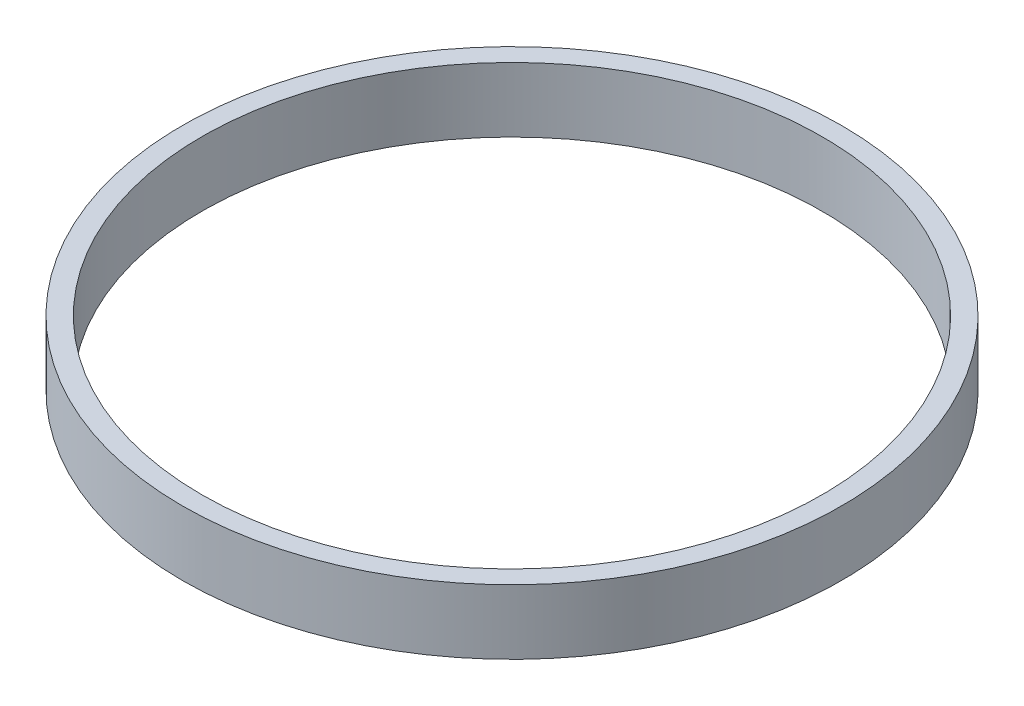
ISO-10303-21;
HEADER;
FILE_DESCRIPTION(('STEP AP214'),'2;1');
FILE_NAME('part.step','',(''),(''),'','','');
FILE_SCHEMA(('AUTOMOTIVE_DESIGN { 1 0 10303 214 1 1 1 1 }'));
ENDSEC;
DATA;
#1=APPLICATION_CONTEXT('core data for automotive mechanical design processes');
#2=APPLICATION_PROTOCOL_DEFINITION('international standard','automotive_design',2000,#1);
#3=PRODUCT_CONTEXT('',#1,'mechanical');
#4=PRODUCT('Part','Part','',(#3));
#5=PRODUCT_RELATED_PRODUCT_CATEGORY('part','',(#4));
#6=PRODUCT_DEFINITION_FORMATION('','',#4);
#7=PRODUCT_DEFINITION_CONTEXT('part definition',#1,'design');
#8=PRODUCT_DEFINITION('design','',#6,#7);
#9=PRODUCT_DEFINITION_SHAPE('','',#8);
#10=(LENGTH_UNIT() NAMED_UNIT(*) SI_UNIT(.MILLI.,.METRE.));
#11=(NAMED_UNIT(*) PLANE_ANGLE_UNIT() SI_UNIT($,.RADIAN.));
#12=(NAMED_UNIT(*) SI_UNIT($,.STERADIAN.) SOLID_ANGLE_UNIT());
#13=UNCERTAINTY_MEASURE_WITH_UNIT(LENGTH_MEASURE(1.E-05),#10,'distance_accuracy_value','');
#14=(GEOMETRIC_REPRESENTATION_CONTEXT(3) GLOBAL_UNCERTAINTY_ASSIGNED_CONTEXT((#13)) GLOBAL_UNIT_ASSIGNED_CONTEXT((#10,
#11,#12)) REPRESENTATION_CONTEXT('',''));
#15=CARTESIAN_POINT('',(0.,0.,0.));
#16=DIRECTION('',(0.,0.,1.));
#17=DIRECTION('',(1.,0.,0.));
#18=AXIS2_PLACEMENT_3D('',#15,#16,#17);
#19=CARTESIAN_POINT('',(0.,5.,0.));
#20=DIRECTION('',(0.,1.,0.));
#21=DIRECTION('',(0.,0.,1.));
#22=AXIS2_PLACEMENT_3D('',#19,#20,#21);
#23=PLANE('',#22);
#24=CARTESIAN_POINT('',(0.,5.,0.));
#25=DIRECTION('',(0.,1.,0.));
#26=DIRECTION('',(0.,0.,1.));
#27=AXIS2_PLACEMENT_3D('',#24,#25,#26);
#28=CIRCLE('',#27,25.5);
#29=CARTESIAN_POINT('',(0.,5.,25.5));
#30=VERTEX_POINT('',#29);
#31=EDGE_CURVE('E10',#30,#30,#28,.T.);
#32=ORIENTED_EDGE('',*,*,#31,.T.);
#33=EDGE_LOOP('',(#32));
#34=FACE_BOUND('',#33,.T.);
#35=CARTESIAN_POINT('',(0.,5.,0.));
#36=DIRECTION('',(0.,1.,0.));
#37=DIRECTION('',(0.,0.,1.));
#38=AXIS2_PLACEMENT_3D('',#35,#36,#37);
#39=CIRCLE('',#38,24.);
#40=CARTESIAN_POINT('',(0.,5.,24.));
#41=VERTEX_POINT('',#40);
#42=EDGE_CURVE('E46',#41,#41,#39,.T.);
#43=ORIENTED_EDGE('',*,*,#42,.F.);
#44=EDGE_LOOP('',(#43));
#45=FACE_BOUND('',#44,.T.);
#46=ADVANCED_FACE('F35',(#34,#45),#23,.T.);
#47=CARTESIAN_POINT('',(0.,0.,0.));
#48=DIRECTION('',(0.,1.,0.));
#49=DIRECTION('',(0.,0.,1.));
#50=AXIS2_PLACEMENT_3D('',#47,#48,#49);
#51=PLANE('',#50);
#52=CARTESIAN_POINT('',(0.,0.,0.));
#53=DIRECTION('',(0.,1.,0.));
#54=DIRECTION('',(0.,0.,1.));
#55=AXIS2_PLACEMENT_3D('',#52,#53,#54);
#56=CIRCLE('',#55,25.5);
#57=CARTESIAN_POINT('',(0.,0.,25.5));
#58=VERTEX_POINT('',#57);
#59=EDGE_CURVE('E39',#58,#58,#56,.T.);
#60=ORIENTED_EDGE('',*,*,#59,.F.);
#61=EDGE_LOOP('',(#60));
#62=FACE_BOUND('',#61,.T.);
#63=CARTESIAN_POINT('',(0.,0.,0.));
#64=DIRECTION('',(0.,1.,0.));
#65=DIRECTION('',(0.,0.,1.));
#66=AXIS2_PLACEMENT_3D('',#63,#64,#65);
#67=CIRCLE('',#66,24.);
#68=CARTESIAN_POINT('',(0.,0.,24.));
#69=VERTEX_POINT('',#68);
#70=EDGE_CURVE('E48',#69,#69,#67,.T.);
#71=ORIENTED_EDGE('',*,*,#70,.T.);
#72=EDGE_LOOP('',(#71));
#73=FACE_BOUND('',#72,.T.);
#74=ADVANCED_FACE('F58',(#62,#73),#51,.F.);
#75=CARTESIAN_POINT('',(0.,5.,0.));
#76=DIRECTION('',(0.,-1.,0.));
#77=DIRECTION('',(0.,0.,-1.));
#78=AXIS2_PLACEMENT_3D('',#75,#76,#77);
#79=CYLINDRICAL_SURFACE('',#78,25.5);
#80=ORIENTED_EDGE('',*,*,#31,.F.);
#81=EDGE_LOOP('',(#80));
#82=FACE_BOUND('',#81,.T.);
#83=ORIENTED_EDGE('',*,*,#59,.T.);
#84=EDGE_LOOP('',(#83));
#85=FACE_BOUND('',#84,.T.);
#86=ADVANCED_FACE('F37',(#82,#85),#79,.T.);
#87=CARTESIAN_POINT('',(0.,5.,0.));
#88=DIRECTION('',(0.,-1.,0.));
#89=DIRECTION('',(0.,0.,-1.));
#90=AXIS2_PLACEMENT_3D('',#87,#88,#89);
#91=CYLINDRICAL_SURFACE('',#90,24.);
#92=ORIENTED_EDGE('',*,*,#42,.T.);
#93=EDGE_LOOP('',(#92));
#94=FACE_BOUND('',#93,.T.);
#95=ORIENTED_EDGE('',*,*,#70,.F.);
#96=EDGE_LOOP('',(#95));
#97=FACE_BOUND('',#96,.T.);
#98=ADVANCED_FACE('F54',(#94,#97),#91,.F.);
#99=CLOSED_SHELL('',(#46,#74,#86,#98));
#100=MANIFOLD_SOLID_BREP('B2',#99);
#101=ADVANCED_BREP_SHAPE_REPRESENTATION('',(#18,#100),#14);
#102=SHAPE_DEFINITION_REPRESENTATION(#9,#101);
ENDSEC;
END-ISO-10303-21;
